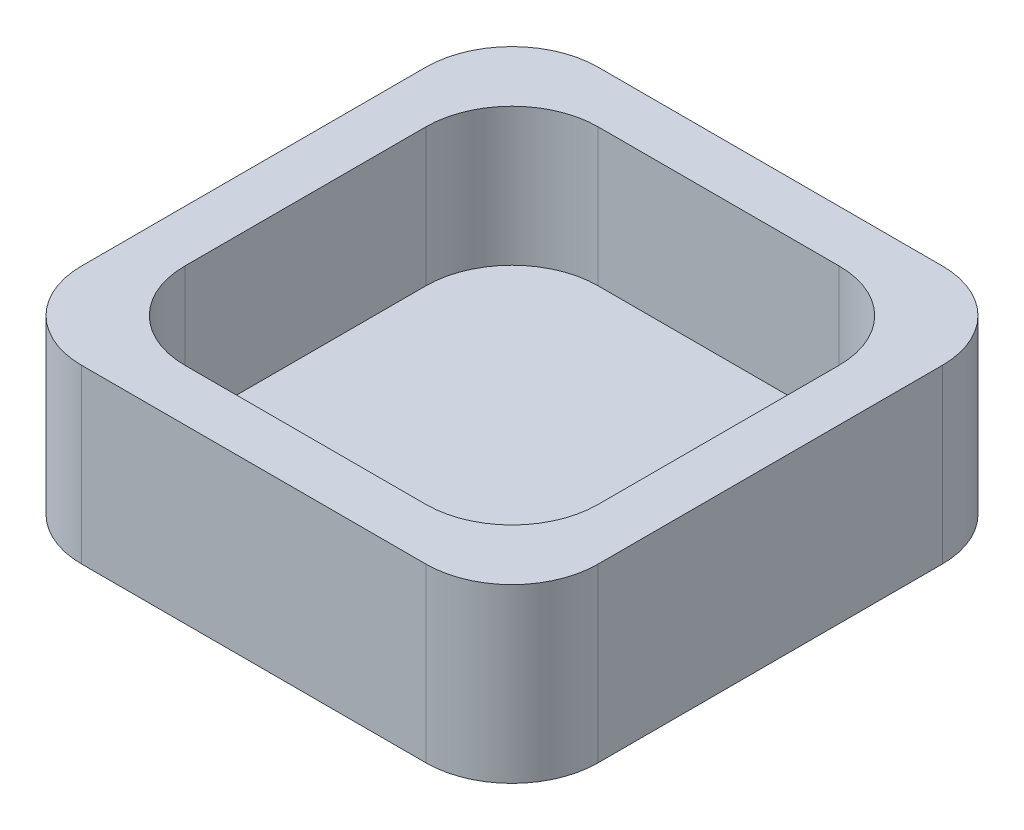
ISO-10303-21;
HEADER;
FILE_DESCRIPTION(('STEP AP214'),'2;1');
FILE_NAME('part.step','',(''),(''),'','','');
FILE_SCHEMA(('AUTOMOTIVE_DESIGN { 1 0 10303 214 1 1 1 1 }'));
ENDSEC;
DATA;
#1=APPLICATION_CONTEXT('core data for automotive mechanical design processes');
#2=APPLICATION_PROTOCOL_DEFINITION('international standard','automotive_design',2000,#1);
#3=PRODUCT_CONTEXT('',#1,'mechanical');
#4=PRODUCT('Part','Part','',(#3));
#5=PRODUCT_RELATED_PRODUCT_CATEGORY('part','',(#4));
#6=PRODUCT_DEFINITION_FORMATION('','',#4);
#7=PRODUCT_DEFINITION_CONTEXT('part definition',#1,'design');
#8=PRODUCT_DEFINITION('design','',#6,#7);
#9=PRODUCT_DEFINITION_SHAPE('','',#8);
#10=(LENGTH_UNIT() NAMED_UNIT(*) SI_UNIT(.MILLI.,.METRE.));
#11=(NAMED_UNIT(*) PLANE_ANGLE_UNIT() SI_UNIT($,.RADIAN.));
#12=(NAMED_UNIT(*) SI_UNIT($,.STERADIAN.) SOLID_ANGLE_UNIT());
#13=UNCERTAINTY_MEASURE_WITH_UNIT(LENGTH_MEASURE(1.E-05),#10,'distance_accuracy_value','');
#14=(GEOMETRIC_REPRESENTATION_CONTEXT(3) GLOBAL_UNCERTAINTY_ASSIGNED_CONTEXT((#13)) GLOBAL_UNIT_ASSIGNED_CONTEXT((#10,
#11,#12)) REPRESENTATION_CONTEXT('',''));
#15=CARTESIAN_POINT('',(0.,0.,0.));
#16=DIRECTION('',(0.,0.,1.));
#17=DIRECTION('',(1.,0.,0.));
#18=AXIS2_PLACEMENT_3D('',#15,#16,#17);
#19=CARTESIAN_POINT('',(0.,10.,0.));
#20=DIRECTION('',(-1.,0.,0.));
#21=DIRECTION('',(0.,0.,1.));
#22=AXIS2_PLACEMENT_3D('',#19,#20,#21);
#23=PLANE('',#22);
#24=DIRECTION('',(0.,0.,-1.));
#25=VECTOR('',#24,1.);
#26=CARTESIAN_POINT('',(0.,0.,0.));
#27=LINE('',#26,#25);
#28=CARTESIAN_POINT('',(0.,0.,25.));
#29=VERTEX_POINT('',#28);
#30=CARTESIAN_POINT('',(0.,0.,5.));
#31=VERTEX_POINT('',#30);
#32=EDGE_CURVE('E174',#29,#31,#27,.T.);
#33=ORIENTED_EDGE('',*,*,#32,.T.);
#34=DIRECTION('',(0.,-1.,0.));
#35=VECTOR('',#34,1.);
#36=CARTESIAN_POINT('',(0.,10.,5.));
#37=LINE('',#36,#35);
#38=CARTESIAN_POINT('',(0.,10.,5.));
#39=VERTEX_POINT('',#38);
#40=EDGE_CURVE('E152',#31,#39,#37,.F.);
#41=ORIENTED_EDGE('',*,*,#40,.T.);
#42=DIRECTION('',(0.,0.,-1.));
#43=VECTOR('',#42,1.);
#44=CARTESIAN_POINT('',(0.,10.,0.));
#45=LINE('',#44,#43);
#46=CARTESIAN_POINT('',(0.,10.,25.));
#47=VERTEX_POINT('',#46);
#48=EDGE_CURVE('E185',#47,#39,#45,.T.);
#49=ORIENTED_EDGE('',*,*,#48,.F.);
#50=DIRECTION('',(0.,-1.,0.));
#51=VECTOR('',#50,1.);
#52=CARTESIAN_POINT('',(0.,10.,25.));
#53=LINE('',#52,#51);
#54=EDGE_CURVE('E157',#47,#29,#53,.T.);
#55=ORIENTED_EDGE('',*,*,#54,.T.);
#56=EDGE_LOOP('',(#33,#41,#49,#55));
#57=FACE_BOUND('',#56,.T.);
#58=ADVANCED_FACE('F35',(#57),#23,.F.);
#59=CARTESIAN_POINT('',(0.,10.,0.));
#60=DIRECTION('',(0.,0.,1.));
#61=DIRECTION('',(1.,0.,0.));
#62=AXIS2_PLACEMENT_3D('',#59,#60,#61);
#63=PLANE('',#62);
#64=DIRECTION('',(-1.,0.,0.));
#65=VECTOR('',#64,1.);
#66=CARTESIAN_POINT('',(0.,10.,0.));
#67=LINE('',#66,#65);
#68=CARTESIAN_POINT('',(-5.,10.,0.));
#69=VERTEX_POINT('',#68);
#70=CARTESIAN_POINT('',(-25.,10.,0.));
#71=VERTEX_POINT('',#70);
#72=EDGE_CURVE('E167',#69,#71,#67,.T.);
#73=ORIENTED_EDGE('',*,*,#72,.F.);
#74=DIRECTION('',(0.,-1.,0.));
#75=VECTOR('',#74,1.);
#76=CARTESIAN_POINT('',(-5.,10.,0.));
#77=LINE('',#76,#75);
#78=CARTESIAN_POINT('',(-5.,0.,0.));
#79=VERTEX_POINT('',#78);
#80=EDGE_CURVE('E151',#69,#79,#77,.T.);
#81=ORIENTED_EDGE('',*,*,#80,.T.);
#82=DIRECTION('',(-1.,0.,0.));
#83=VECTOR('',#82,1.);
#84=CARTESIAN_POINT('',(0.,0.,0.));
#85=LINE('',#84,#83);
#86=CARTESIAN_POINT('',(-25.,0.,0.));
#87=VERTEX_POINT('',#86);
#88=EDGE_CURVE('E164',#79,#87,#85,.T.);
#89=ORIENTED_EDGE('',*,*,#88,.T.);
#90=DIRECTION('',(0.,-1.,0.));
#91=VECTOR('',#90,1.);
#92=CARTESIAN_POINT('',(-25.,10.,0.));
#93=LINE('',#92,#91);
#94=EDGE_CURVE('E169',#87,#71,#93,.F.);
#95=ORIENTED_EDGE('',*,*,#94,.T.);
#96=EDGE_LOOP('',(#73,#81,#89,#95));
#97=FACE_BOUND('',#96,.T.);
#98=ADVANCED_FACE('F163',(#97),#63,.F.);
#99=CARTESIAN_POINT('',(-30.,10.,0.));
#100=DIRECTION('',(1.,0.,0.));
#101=DIRECTION('',(0.,0.,-1.));
#102=AXIS2_PLACEMENT_3D('',#99,#100,#101);
#103=PLANE('',#102);
#104=DIRECTION('',(0.,0.,1.));
#105=VECTOR('',#104,1.);
#106=CARTESIAN_POINT('',(-30.,0.,0.));
#107=LINE('',#106,#105);
#108=CARTESIAN_POINT('',(-30.,0.,5.));
#109=VERTEX_POINT('',#108);
#110=CARTESIAN_POINT('',(-30.,0.,25.));
#111=VERTEX_POINT('',#110);
#112=EDGE_CURVE('E173',#109,#111,#107,.T.);
#113=ORIENTED_EDGE('',*,*,#112,.T.);
#114=DIRECTION('',(0.,-1.,0.));
#115=VECTOR('',#114,1.);
#116=CARTESIAN_POINT('',(-30.,10.,25.));
#117=LINE('',#116,#115);
#118=CARTESIAN_POINT('',(-30.,10.,25.));
#119=VERTEX_POINT('',#118);
#120=EDGE_CURVE('E211',#111,#119,#117,.F.);
#121=ORIENTED_EDGE('',*,*,#120,.T.);
#122=DIRECTION('',(0.,0.,1.));
#123=VECTOR('',#122,1.);
#124=CARTESIAN_POINT('',(-30.,10.,0.));
#125=LINE('',#124,#123);
#126=CARTESIAN_POINT('',(-30.,10.,5.));
#127=VERTEX_POINT('',#126);
#128=EDGE_CURVE('E288',#127,#119,#125,.T.);
#129=ORIENTED_EDGE('',*,*,#128,.F.);
#130=DIRECTION('',(0.,-1.,0.));
#131=VECTOR('',#130,1.);
#132=CARTESIAN_POINT('',(-30.,10.,5.));
#133=LINE('',#132,#131);
#134=EDGE_CURVE('E208',#127,#109,#133,.T.);
#135=ORIENTED_EDGE('',*,*,#134,.T.);
#136=EDGE_LOOP('',(#113,#121,#129,#135));
#137=FACE_BOUND('',#136,.T.);
#138=ADVANCED_FACE('F308',(#137),#103,.F.);
#139=CARTESIAN_POINT('',(0.,10.,30.));
#140=DIRECTION('',(0.,0.,-1.));
#141=DIRECTION('',(-1.,0.,0.));
#142=AXIS2_PLACEMENT_3D('',#139,#140,#141);
#143=PLANE('',#142);
#144=DIRECTION('',(1.,0.,0.));
#145=VECTOR('',#144,1.);
#146=CARTESIAN_POINT('',(0.,0.,30.));
#147=LINE('',#146,#145);
#148=CARTESIAN_POINT('',(-25.,0.,30.));
#149=VERTEX_POINT('',#148);
#150=CARTESIAN_POINT('',(-4.99999999999999,0.,30.));
#151=VERTEX_POINT('',#150);
#152=EDGE_CURVE('E177',#149,#151,#147,.T.);
#153=ORIENTED_EDGE('',*,*,#152,.T.);
#154=DIRECTION('',(0.,-1.,0.));
#155=VECTOR('',#154,1.);
#156=CARTESIAN_POINT('',(-5.,10.,30.));
#157=LINE('',#156,#155);
#158=CARTESIAN_POINT('',(-4.99999999999999,10.,30.));
#159=VERTEX_POINT('',#158);
#160=EDGE_CURVE('E206',#151,#159,#157,.F.);
#161=ORIENTED_EDGE('',*,*,#160,.T.);
#162=DIRECTION('',(1.,0.,0.));
#163=VECTOR('',#162,1.);
#164=CARTESIAN_POINT('',(0.,10.,30.));
#165=LINE('',#164,#163);
#166=CARTESIAN_POINT('',(-25.,10.,30.));
#167=VERTEX_POINT('',#166);
#168=EDGE_CURVE('E186',#167,#159,#165,.T.);
#169=ORIENTED_EDGE('',*,*,#168,.F.);
#170=DIRECTION('',(0.,-1.,0.));
#171=VECTOR('',#170,1.);
#172=CARTESIAN_POINT('',(-25.,10.,30.));
#173=LINE('',#172,#171);
#174=EDGE_CURVE('E203',#167,#149,#173,.T.);
#175=ORIENTED_EDGE('',*,*,#174,.T.);
#176=EDGE_LOOP('',(#153,#161,#169,#175));
#177=FACE_BOUND('',#176,.T.);
#178=ADVANCED_FACE('F303',(#177),#143,.F.);
#179=CARTESIAN_POINT('',(0.,10.,0.));
#180=DIRECTION('',(0.,-1.,0.));
#181=DIRECTION('',(0.,0.,-1.));
#182=AXIS2_PLACEMENT_3D('',#179,#180,#181);
#183=PLANE('',#182);
#184=DIRECTION('',(1.,0.,0.));
#185=VECTOR('',#184,1.);
#186=CARTESIAN_POINT('',(-27.,10.,27.));
#187=LINE('',#186,#185);
#188=CARTESIAN_POINT('',(-22.,10.,27.));
#189=VERTEX_POINT('',#188);
#190=CARTESIAN_POINT('',(-8.,10.,27.));
#191=VERTEX_POINT('',#190);
#192=EDGE_CURVE('E281',#189,#191,#187,.T.);
#193=ORIENTED_EDGE('',*,*,#192,.F.);
#194=CARTESIAN_POINT('',(-22.,10.,22.));
#195=DIRECTION('',(0.,-1.,0.));
#196=DIRECTION('',(0.,0.,-1.));
#197=AXIS2_PLACEMENT_3D('',#194,#195,#196);
#198=CIRCLE('',#197,5.);
#199=CARTESIAN_POINT('',(-27.,10.,22.));
#200=VERTEX_POINT('',#199);
#201=EDGE_CURVE('E11',#189,#200,#198,.T.);
#202=ORIENTED_EDGE('',*,*,#201,.T.);
#203=DIRECTION('',(0.,0.,1.));
#204=VECTOR('',#203,1.);
#205=CARTESIAN_POINT('',(-27.,10.,3.));
#206=LINE('',#205,#204);
#207=CARTESIAN_POINT('',(-27.,10.,8.));
#208=VERTEX_POINT('',#207);
#209=EDGE_CURVE('E250',#208,#200,#206,.T.);
#210=ORIENTED_EDGE('',*,*,#209,.F.);
#211=CARTESIAN_POINT('',(-22.,10.,8.));
#212=DIRECTION('',(0.,-1.,0.));
#213=DIRECTION('',(0.,0.,-1.));
#214=AXIS2_PLACEMENT_3D('',#211,#212,#213);
#215=CIRCLE('',#214,5.);
#216=CARTESIAN_POINT('',(-22.,10.,3.));
#217=VERTEX_POINT('',#216);
#218=EDGE_CURVE('E242',#208,#217,#215,.T.);
#219=ORIENTED_EDGE('',*,*,#218,.T.);
#220=DIRECTION('',(-1.,0.,0.));
#221=VECTOR('',#220,1.);
#222=CARTESIAN_POINT('',(-27.,10.,3.));
#223=LINE('',#222,#221);
#224=CARTESIAN_POINT('',(-8.,10.,3.));
#225=VERTEX_POINT('',#224);
#226=EDGE_CURVE('E248',#225,#217,#223,.T.);
#227=ORIENTED_EDGE('',*,*,#226,.F.);
#228=CARTESIAN_POINT('',(-8.,10.,8.));
#229=DIRECTION('',(0.,-1.,0.));
#230=DIRECTION('',(0.,0.,-1.));
#231=AXIS2_PLACEMENT_3D('',#228,#229,#230);
#232=CIRCLE('',#231,5.);
#233=CARTESIAN_POINT('',(-2.99999999999999,10.,8.));
#234=VERTEX_POINT('',#233);
#235=EDGE_CURVE('E240',#225,#234,#232,.T.);
#236=ORIENTED_EDGE('',*,*,#235,.T.);
#237=DIRECTION('',(0.,0.,-1.));
#238=VECTOR('',#237,1.);
#239=CARTESIAN_POINT('',(-3.,10.,3.));
#240=LINE('',#239,#238);
#241=CARTESIAN_POINT('',(-2.99999999999999,10.,22.));
#242=VERTEX_POINT('',#241);
#243=EDGE_CURVE('E260',#242,#234,#240,.T.);
#244=ORIENTED_EDGE('',*,*,#243,.F.);
#245=CARTESIAN_POINT('',(-7.99999999999999,10.,22.));
#246=DIRECTION('',(0.,-1.,0.));
#247=DIRECTION('',(0.,0.,-1.));
#248=AXIS2_PLACEMENT_3D('',#245,#246,#247);
#249=CIRCLE('',#248,5.);
#250=EDGE_CURVE('E43',#242,#191,#249,.T.);
#251=ORIENTED_EDGE('',*,*,#250,.T.);
#252=EDGE_LOOP('',(#193,#202,#210,#219,#227,#236,#244,#251));
#253=FACE_BOUND('',#252,.T.);
#254=ORIENTED_EDGE('',*,*,#48,.T.);
#255=CARTESIAN_POINT('',(-5.,10.,5.));
#256=DIRECTION('',(0.,-1.,0.));
#257=DIRECTION('',(0.,0.,-1.));
#258=AXIS2_PLACEMENT_3D('',#255,#256,#257);
#259=CIRCLE('',#258,5.);
#260=EDGE_CURVE('E201',#39,#69,#259,.F.);
#261=ORIENTED_EDGE('',*,*,#260,.T.);
#262=ORIENTED_EDGE('',*,*,#72,.T.);
#263=CARTESIAN_POINT('',(-25.,10.,5.));
#264=DIRECTION('',(0.,-1.,0.));
#265=DIRECTION('',(0.,0.,-1.));
#266=AXIS2_PLACEMENT_3D('',#263,#264,#265);
#267=CIRCLE('',#266,5.);
#268=EDGE_CURVE('E195',#71,#127,#267,.F.);
#269=ORIENTED_EDGE('',*,*,#268,.T.);
#270=ORIENTED_EDGE('',*,*,#128,.T.);
#271=CARTESIAN_POINT('',(-25.,10.,25.));
#272=DIRECTION('',(0.,-1.,0.));
#273=DIRECTION('',(0.,0.,-1.));
#274=AXIS2_PLACEMENT_3D('',#271,#272,#273);
#275=CIRCLE('',#274,5.);
#276=EDGE_CURVE('E197',#119,#167,#275,.F.);
#277=ORIENTED_EDGE('',*,*,#276,.T.);
#278=ORIENTED_EDGE('',*,*,#168,.T.);
#279=CARTESIAN_POINT('',(-5.,10.,25.));
#280=DIRECTION('',(0.,-1.,0.));
#281=DIRECTION('',(0.,0.,-1.));
#282=AXIS2_PLACEMENT_3D('',#279,#280,#281);
#283=CIRCLE('',#282,5.);
#284=EDGE_CURVE('E199',#159,#47,#283,.F.);
#285=ORIENTED_EDGE('',*,*,#284,.T.);
#286=EDGE_LOOP('',(#254,#261,#262,#269,#270,#277,#278,#285));
#287=FACE_BOUND('',#286,.T.);
#288=ADVANCED_FACE('F246',(#253,#287),#183,.F.);
#289=CARTESIAN_POINT('',(0.,0.,0.));
#290=DIRECTION('',(0.,-1.,0.));
#291=DIRECTION('',(0.,0.,-1.));
#292=AXIS2_PLACEMENT_3D('',#289,#290,#291);
#293=PLANE('',#292);
#294=ORIENTED_EDGE('',*,*,#88,.F.);
#295=CARTESIAN_POINT('',(-5.,0.,5.));
#296=DIRECTION('',(0.,-1.,0.));
#297=DIRECTION('',(0.,0.,-1.));
#298=AXIS2_PLACEMENT_3D('',#295,#296,#297);
#299=CIRCLE('',#298,5.);
#300=EDGE_CURVE('E147',#79,#31,#299,.T.);
#301=ORIENTED_EDGE('',*,*,#300,.T.);
#302=ORIENTED_EDGE('',*,*,#32,.F.);
#303=CARTESIAN_POINT('',(-5.,0.,25.));
#304=DIRECTION('',(0.,-1.,0.));
#305=DIRECTION('',(0.,0.,-1.));
#306=AXIS2_PLACEMENT_3D('',#303,#304,#305);
#307=CIRCLE('',#306,5.);
#308=EDGE_CURVE('E158',#29,#151,#307,.T.);
#309=ORIENTED_EDGE('',*,*,#308,.T.);
#310=ORIENTED_EDGE('',*,*,#152,.F.);
#311=CARTESIAN_POINT('',(-25.,0.,25.));
#312=DIRECTION('',(0.,-1.,0.));
#313=DIRECTION('',(0.,0.,-1.));
#314=AXIS2_PLACEMENT_3D('',#311,#312,#313);
#315=CIRCLE('',#314,5.);
#316=EDGE_CURVE('E189',#149,#111,#315,.T.);
#317=ORIENTED_EDGE('',*,*,#316,.T.);
#318=ORIENTED_EDGE('',*,*,#112,.F.);
#319=CARTESIAN_POINT('',(-25.,0.,5.));
#320=DIRECTION('',(0.,-1.,0.));
#321=DIRECTION('',(0.,0.,-1.));
#322=AXIS2_PLACEMENT_3D('',#319,#320,#321);
#323=CIRCLE('',#322,5.);
#324=EDGE_CURVE('E168',#109,#87,#323,.T.);
#325=ORIENTED_EDGE('',*,*,#324,.T.);
#326=EDGE_LOOP('',(#294,#301,#302,#309,#310,#317,#318,#325));
#327=FACE_BOUND('',#326,.T.);
#328=ADVANCED_FACE('F171',(#327),#293,.T.);
#329=CARTESIAN_POINT('',(-27.,2.,3.));
#330=DIRECTION('',(-1.,0.,0.));
#331=DIRECTION('',(0.,0.,1.));
#332=AXIS2_PLACEMENT_3D('',#329,#330,#331);
#333=PLANE('',#332);
#334=DIRECTION('',(0.,0.,1.));
#335=VECTOR('',#334,1.);
#336=CARTESIAN_POINT('',(-27.,2.,3.));
#337=LINE('',#336,#335);
#338=CARTESIAN_POINT('',(-27.,2.,8.));
#339=VERTEX_POINT('',#338);
#340=CARTESIAN_POINT('',(-27.,2.,22.));
#341=VERTEX_POINT('',#340);
#342=EDGE_CURVE('E259',#339,#341,#337,.T.);
#343=ORIENTED_EDGE('',*,*,#342,.F.);
#344=DIRECTION('',(0.,1.,0.));
#345=VECTOR('',#344,1.);
#346=CARTESIAN_POINT('',(-27.,10.,8.));
#347=LINE('',#346,#345);
#348=EDGE_CURVE('E233',#339,#208,#347,.T.);
#349=ORIENTED_EDGE('',*,*,#348,.T.);
#350=ORIENTED_EDGE('',*,*,#209,.T.);
#351=DIRECTION('',(0.,1.,0.));
#352=VECTOR('',#351,1.);
#353=CARTESIAN_POINT('',(-27.,2.,22.));
#354=LINE('',#353,#352);
#355=EDGE_CURVE('E231',#200,#341,#354,.F.);
#356=ORIENTED_EDGE('',*,*,#355,.T.);
#357=EDGE_LOOP('',(#343,#349,#350,#356));
#358=FACE_BOUND('',#357,.T.);
#359=ADVANCED_FACE('F271',(#358),#333,.F.);
#360=CARTESIAN_POINT('',(-27.,2.,3.));
#361=DIRECTION('',(0.,0.,-1.));
#362=DIRECTION('',(-1.,0.,0.));
#363=AXIS2_PLACEMENT_3D('',#360,#361,#362);
#364=PLANE('',#363);
#365=DIRECTION('',(-1.,0.,0.));
#366=VECTOR('',#365,1.);
#367=CARTESIAN_POINT('',(-27.,2.,3.));
#368=LINE('',#367,#366);
#369=CARTESIAN_POINT('',(-8.,2.,3.));
#370=VERTEX_POINT('',#369);
#371=CARTESIAN_POINT('',(-22.,2.,3.));
#372=VERTEX_POINT('',#371);
#373=EDGE_CURVE('E179',#370,#372,#368,.T.);
#374=ORIENTED_EDGE('',*,*,#373,.F.);
#375=DIRECTION('',(0.,1.,0.));
#376=VECTOR('',#375,1.);
#377=CARTESIAN_POINT('',(-8.,10.,3.));
#378=LINE('',#377,#376);
#379=EDGE_CURVE('E215',#370,#225,#378,.T.);
#380=ORIENTED_EDGE('',*,*,#379,.T.);
#381=ORIENTED_EDGE('',*,*,#226,.T.);
#382=DIRECTION('',(0.,1.,0.));
#383=VECTOR('',#382,1.);
#384=CARTESIAN_POINT('',(-22.,2.,3.));
#385=LINE('',#384,#383);
#386=EDGE_CURVE('E213',#217,#372,#385,.F.);
#387=ORIENTED_EDGE('',*,*,#386,.T.);
#388=EDGE_LOOP('',(#374,#380,#381,#387));
#389=FACE_BOUND('',#388,.T.);
#390=ADVANCED_FACE('F256',(#389),#364,.F.);
#391=CARTESIAN_POINT('',(-3.,2.,3.));
#392=DIRECTION('',(1.,0.,0.));
#393=DIRECTION('',(0.,0.,-1.));
#394=AXIS2_PLACEMENT_3D('',#391,#392,#393);
#395=PLANE('',#394);
#396=ORIENTED_EDGE('',*,*,#243,.T.);
#397=DIRECTION('',(0.,1.,0.));
#398=VECTOR('',#397,1.);
#399=CARTESIAN_POINT('',(-2.99999999999999,2.,8.));
#400=LINE('',#399,#398);
#401=CARTESIAN_POINT('',(-2.99999999999999,2.,8.));
#402=VERTEX_POINT('',#401);
#403=EDGE_CURVE('E221',#234,#402,#400,.F.);
#404=ORIENTED_EDGE('',*,*,#403,.T.);
#405=DIRECTION('',(0.,0.,-1.));
#406=VECTOR('',#405,1.);
#407=CARTESIAN_POINT('',(-3.,2.,3.));
#408=LINE('',#407,#406);
#409=CARTESIAN_POINT('',(-2.99999999999999,2.,22.));
#410=VERTEX_POINT('',#409);
#411=EDGE_CURVE('E275',#410,#402,#408,.T.);
#412=ORIENTED_EDGE('',*,*,#411,.F.);
#413=DIRECTION('',(0.,1.,0.));
#414=VECTOR('',#413,1.);
#415=CARTESIAN_POINT('',(-2.99999999999999,10.,22.));
#416=LINE('',#415,#414);
#417=EDGE_CURVE('E218',#410,#242,#416,.T.);
#418=ORIENTED_EDGE('',*,*,#417,.T.);
#419=EDGE_LOOP('',(#396,#404,#412,#418));
#420=FACE_BOUND('',#419,.T.);
#421=ADVANCED_FACE('F378',(#420),#395,.F.);
#422=CARTESIAN_POINT('',(-27.,2.,27.));
#423=DIRECTION('',(0.,0.,1.));
#424=DIRECTION('',(1.,0.,0.));
#425=AXIS2_PLACEMENT_3D('',#422,#423,#424);
#426=PLANE('',#425);
#427=ORIENTED_EDGE('',*,*,#192,.T.);
#428=DIRECTION('',(0.,1.,0.));
#429=VECTOR('',#428,1.);
#430=CARTESIAN_POINT('',(-7.99999999999999,2.,27.));
#431=LINE('',#430,#429);
#432=CARTESIAN_POINT('',(-8.,2.,27.));
#433=VERTEX_POINT('',#432);
#434=EDGE_CURVE('E238',#191,#433,#431,.F.);
#435=ORIENTED_EDGE('',*,*,#434,.T.);
#436=DIRECTION('',(1.,0.,0.));
#437=VECTOR('',#436,1.);
#438=CARTESIAN_POINT('',(-27.,2.,27.));
#439=LINE('',#438,#437);
#440=CARTESIAN_POINT('',(-22.,2.,27.));
#441=VERTEX_POINT('',#440);
#442=EDGE_CURVE('E272',#441,#433,#439,.T.);
#443=ORIENTED_EDGE('',*,*,#442,.F.);
#444=DIRECTION('',(0.,1.,0.));
#445=VECTOR('',#444,1.);
#446=CARTESIAN_POINT('',(-22.,10.,27.));
#447=LINE('',#446,#445);
#448=EDGE_CURVE('E236',#441,#189,#447,.T.);
#449=ORIENTED_EDGE('',*,*,#448,.T.);
#450=EDGE_LOOP('',(#427,#435,#443,#449));
#451=FACE_BOUND('',#450,.T.);
#452=ADVANCED_FACE('F387',(#451),#426,.F.);
#453=CARTESIAN_POINT('',(0.,2.,0.));
#454=DIRECTION('',(0.,1.,0.));
#455=DIRECTION('',(0.,0.,1.));
#456=AXIS2_PLACEMENT_3D('',#453,#454,#455);
#457=PLANE('',#456);
#458=ORIENTED_EDGE('',*,*,#411,.T.);
#459=CARTESIAN_POINT('',(-8.,2.,8.));
#460=DIRECTION('',(0.,1.,0.));
#461=DIRECTION('',(0.,0.,1.));
#462=AXIS2_PLACEMENT_3D('',#459,#460,#461);
#463=CIRCLE('',#462,5.);
#464=EDGE_CURVE('E229',#402,#370,#463,.T.);
#465=ORIENTED_EDGE('',*,*,#464,.T.);
#466=ORIENTED_EDGE('',*,*,#373,.T.);
#467=CARTESIAN_POINT('',(-22.,2.,8.));
#468=DIRECTION('',(0.,1.,0.));
#469=DIRECTION('',(0.,0.,1.));
#470=AXIS2_PLACEMENT_3D('',#467,#468,#469);
#471=CIRCLE('',#470,5.);
#472=EDGE_CURVE('E227',#372,#339,#471,.T.);
#473=ORIENTED_EDGE('',*,*,#472,.T.);
#474=ORIENTED_EDGE('',*,*,#342,.T.);
#475=CARTESIAN_POINT('',(-22.,2.,22.));
#476=DIRECTION('',(0.,1.,0.));
#477=DIRECTION('',(0.,0.,1.));
#478=AXIS2_PLACEMENT_3D('',#475,#476,#477);
#479=CIRCLE('',#478,5.);
#480=EDGE_CURVE('E223',#341,#441,#479,.T.);
#481=ORIENTED_EDGE('',*,*,#480,.T.);
#482=ORIENTED_EDGE('',*,*,#442,.T.);
#483=CARTESIAN_POINT('',(-7.99999999999999,2.,22.));
#484=DIRECTION('',(0.,1.,0.));
#485=DIRECTION('',(0.,0.,1.));
#486=AXIS2_PLACEMENT_3D('',#483,#484,#485);
#487=CIRCLE('',#486,5.);
#488=EDGE_CURVE('E225',#433,#410,#487,.T.);
#489=ORIENTED_EDGE('',*,*,#488,.T.);
#490=EDGE_LOOP('',(#458,#465,#466,#473,#474,#481,#482,#489));
#491=FACE_BOUND('',#490,.T.);
#492=ADVANCED_FACE('F268',(#491),#457,.T.);
#493=CARTESIAN_POINT('',(-5.,10.,5.));
#494=DIRECTION('',(0.,-1.,0.));
#495=DIRECTION('',(0.,0.,-1.));
#496=AXIS2_PLACEMENT_3D('',#493,#494,#495);
#497=CYLINDRICAL_SURFACE('',#496,5.);
#498=ORIENTED_EDGE('',*,*,#260,.F.);
#499=ORIENTED_EDGE('',*,*,#40,.F.);
#500=ORIENTED_EDGE('',*,*,#300,.F.);
#501=ORIENTED_EDGE('',*,*,#80,.F.);
#502=EDGE_LOOP('',(#498,#499,#500,#501));
#503=FACE_BOUND('',#502,.T.);
#504=ADVANCED_FACE('F150',(#503),#497,.T.);
#505=CARTESIAN_POINT('',(-5.,10.,25.));
#506=DIRECTION('',(0.,-1.,0.));
#507=DIRECTION('',(0.,0.,-1.));
#508=AXIS2_PLACEMENT_3D('',#505,#506,#507);
#509=CYLINDRICAL_SURFACE('',#508,5.);
#510=ORIENTED_EDGE('',*,*,#284,.F.);
#511=ORIENTED_EDGE('',*,*,#160,.F.);
#512=ORIENTED_EDGE('',*,*,#308,.F.);
#513=ORIENTED_EDGE('',*,*,#54,.F.);
#514=EDGE_LOOP('',(#510,#511,#512,#513));
#515=FACE_BOUND('',#514,.T.);
#516=ADVANCED_FACE('F300',(#515),#509,.T.);
#517=CARTESIAN_POINT('',(-25.,10.,25.));
#518=DIRECTION('',(0.,-1.,0.));
#519=DIRECTION('',(0.,0.,-1.));
#520=AXIS2_PLACEMENT_3D('',#517,#518,#519);
#521=CYLINDRICAL_SURFACE('',#520,5.);
#522=ORIENTED_EDGE('',*,*,#276,.F.);
#523=ORIENTED_EDGE('',*,*,#120,.F.);
#524=ORIENTED_EDGE('',*,*,#316,.F.);
#525=ORIENTED_EDGE('',*,*,#174,.F.);
#526=EDGE_LOOP('',(#522,#523,#524,#525));
#527=FACE_BOUND('',#526,.T.);
#528=ADVANCED_FACE('F305',(#527),#521,.T.);
#529=CARTESIAN_POINT('',(-25.,10.,5.));
#530=DIRECTION('',(0.,-1.,0.));
#531=DIRECTION('',(0.,0.,-1.));
#532=AXIS2_PLACEMENT_3D('',#529,#530,#531);
#533=CYLINDRICAL_SURFACE('',#532,5.);
#534=ORIENTED_EDGE('',*,*,#268,.F.);
#535=ORIENTED_EDGE('',*,*,#94,.F.);
#536=ORIENTED_EDGE('',*,*,#324,.F.);
#537=ORIENTED_EDGE('',*,*,#134,.F.);
#538=EDGE_LOOP('',(#534,#535,#536,#537));
#539=FACE_BOUND('',#538,.T.);
#540=ADVANCED_FACE('F313',(#539),#533,.T.);
#541=CARTESIAN_POINT('',(-8.,2.,8.));
#542=DIRECTION('',(0.,-1.,0.));
#543=DIRECTION('',(0.,0.,-1.));
#544=AXIS2_PLACEMENT_3D('',#541,#542,#543);
#545=CYLINDRICAL_SURFACE('',#544,5.);
#546=ORIENTED_EDGE('',*,*,#464,.F.);
#547=ORIENTED_EDGE('',*,*,#403,.F.);
#548=ORIENTED_EDGE('',*,*,#235,.F.);
#549=ORIENTED_EDGE('',*,*,#379,.F.);
#550=EDGE_LOOP('',(#546,#547,#548,#549));
#551=FACE_BOUND('',#550,.T.);
#552=ADVANCED_FACE('F315',(#551),#545,.F.);
#553=CARTESIAN_POINT('',(-22.,2.,8.));
#554=DIRECTION('',(0.,-1.,0.));
#555=DIRECTION('',(0.,0.,-1.));
#556=AXIS2_PLACEMENT_3D('',#553,#554,#555);
#557=CYLINDRICAL_SURFACE('',#556,5.);
#558=ORIENTED_EDGE('',*,*,#472,.F.);
#559=ORIENTED_EDGE('',*,*,#386,.F.);
#560=ORIENTED_EDGE('',*,*,#218,.F.);
#561=ORIENTED_EDGE('',*,*,#348,.F.);
#562=EDGE_LOOP('',(#558,#559,#560,#561));
#563=FACE_BOUND('',#562,.T.);
#564=ADVANCED_FACE('F263',(#563),#557,.F.);
#565=CARTESIAN_POINT('',(-7.99999999999999,2.,22.));
#566=DIRECTION('',(0.,-1.,0.));
#567=DIRECTION('',(0.,0.,-1.));
#568=AXIS2_PLACEMENT_3D('',#565,#566,#567);
#569=CYLINDRICAL_SURFACE('',#568,5.);
#570=ORIENTED_EDGE('',*,*,#488,.F.);
#571=ORIENTED_EDGE('',*,*,#434,.F.);
#572=ORIENTED_EDGE('',*,*,#250,.F.);
#573=ORIENTED_EDGE('',*,*,#417,.F.);
#574=EDGE_LOOP('',(#570,#571,#572,#573));
#575=FACE_BOUND('',#574,.T.);
#576=ADVANCED_FACE('F419',(#575),#569,.F.);
#577=CARTESIAN_POINT('',(-22.,2.,22.));
#578=DIRECTION('',(0.,-1.,0.));
#579=DIRECTION('',(0.,0.,-1.));
#580=AXIS2_PLACEMENT_3D('',#577,#578,#579);
#581=CYLINDRICAL_SURFACE('',#580,5.);
#582=ORIENTED_EDGE('',*,*,#480,.F.);
#583=ORIENTED_EDGE('',*,*,#355,.F.);
#584=ORIENTED_EDGE('',*,*,#201,.F.);
#585=ORIENTED_EDGE('',*,*,#448,.F.);
#586=EDGE_LOOP('',(#582,#583,#584,#585));
#587=FACE_BOUND('',#586,.T.);
#588=ADVANCED_FACE('F37',(#587),#581,.F.);
#589=CLOSED_SHELL('',(#58,#98,#138,#178,#288,#328,#359,#390,#421,#452,#492,#504,#516,#528,#540,
#552,#564,#576,#588));
#590=MANIFOLD_SOLID_BREP('B2',#589);
#591=ADVANCED_BREP_SHAPE_REPRESENTATION('',(#18,#590),#14);
#592=SHAPE_DEFINITION_REPRESENTATION(#9,#591);
ENDSEC;
END-ISO-10303-21;
